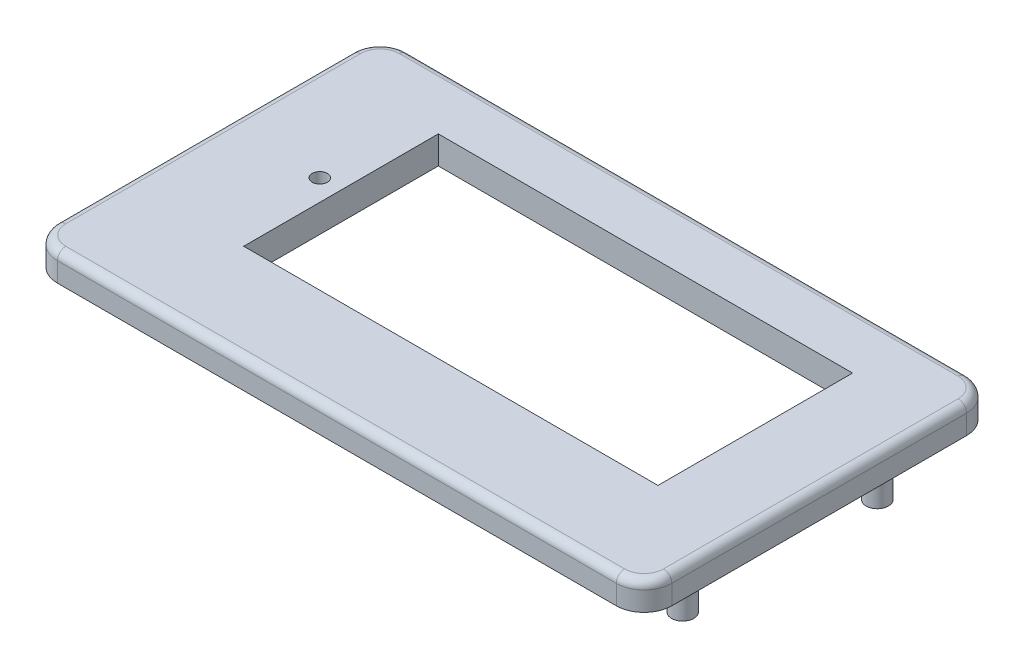
ISO-10303-21;
HEADER;
FILE_DESCRIPTION(('STEP AP214'),'2;1');
FILE_NAME('part.step','',(''),(''),'','','');
FILE_SCHEMA(('AUTOMOTIVE_DESIGN { 1 0 10303 214 1 1 1 1 }'));
ENDSEC;
DATA;
#1=APPLICATION_CONTEXT('core data for automotive mechanical design processes');
#2=APPLICATION_PROTOCOL_DEFINITION('international standard','automotive_design',2000,#1);
#3=PRODUCT_CONTEXT('',#1,'mechanical');
#4=PRODUCT('Part','Part','',(#3));
#5=PRODUCT_RELATED_PRODUCT_CATEGORY('part','',(#4));
#6=PRODUCT_DEFINITION_FORMATION('','',#4);
#7=PRODUCT_DEFINITION_CONTEXT('part definition',#1,'design');
#8=PRODUCT_DEFINITION('design','',#6,#7);
#9=PRODUCT_DEFINITION_SHAPE('','',#8);
#10=(LENGTH_UNIT() NAMED_UNIT(*) SI_UNIT(.MILLI.,.METRE.));
#11=(NAMED_UNIT(*) PLANE_ANGLE_UNIT() SI_UNIT($,.RADIAN.));
#12=(NAMED_UNIT(*) SI_UNIT($,.STERADIAN.) SOLID_ANGLE_UNIT());
#13=UNCERTAINTY_MEASURE_WITH_UNIT(LENGTH_MEASURE(1.E-05),#10,'distance_accuracy_value','');
#14=(GEOMETRIC_REPRESENTATION_CONTEXT(3) GLOBAL_UNCERTAINTY_ASSIGNED_CONTEXT((#13)) GLOBAL_UNIT_ASSIGNED_CONTEXT((#10,
#11,#12)) REPRESENTATION_CONTEXT('',''));
#15=CARTESIAN_POINT('',(0.,0.,0.));
#16=DIRECTION('',(0.,0.,1.));
#17=DIRECTION('',(1.,0.,0.));
#18=AXIS2_PLACEMENT_3D('',#15,#16,#17);
#19=CARTESIAN_POINT('',(28.067,2.54,16.002));
#20=DIRECTION('',(-1.,0.,0.));
#21=DIRECTION('',(0.,0.,1.));
#22=AXIS2_PLACEMENT_3D('',#19,#20,#21);
#23=PLANE('',#22);
#24=DIRECTION('',(0.,-1.,0.));
#25=VECTOR('',#24,1.);
#26=CARTESIAN_POINT('',(28.067,2.54,-13.462));
#27=LINE('',#26,#25);
#28=CARTESIAN_POINT('',(28.067,0.,-13.462));
#29=VERTEX_POINT('',#28);
#30=CARTESIAN_POINT('',(28.067,1.778,-13.462));
#31=VERTEX_POINT('',#30);
#32=EDGE_CURVE('E228',#29,#31,#27,.F.);
#33=ORIENTED_EDGE('',*,*,#32,.T.);
#34=DIRECTION('',(0.,0.,-1.));
#35=VECTOR('',#34,1.);
#36=CARTESIAN_POINT('',(28.067,1.778,16.002));
#37=LINE('',#36,#35);
#38=CARTESIAN_POINT('',(28.067,1.778,13.462));
#39=VERTEX_POINT('',#38);
#40=EDGE_CURVE('E65',#31,#39,#37,.F.);
#41=ORIENTED_EDGE('',*,*,#40,.T.);
#42=DIRECTION('',(0.,-1.,0.));
#43=VECTOR('',#42,1.);
#44=CARTESIAN_POINT('',(28.067,2.54,13.462));
#45=LINE('',#44,#43);
#46=CARTESIAN_POINT('',(28.067,0.,13.462));
#47=VERTEX_POINT('',#46);
#48=EDGE_CURVE('E226',#39,#47,#45,.T.);
#49=ORIENTED_EDGE('',*,*,#48,.T.);
#50=DIRECTION('',(0.,0.,-1.));
#51=VECTOR('',#50,1.);
#52=CARTESIAN_POINT('',(28.067,0.,16.002));
#53=LINE('',#52,#51);
#54=EDGE_CURVE('E196',#47,#29,#53,.T.);
#55=ORIENTED_EDGE('',*,*,#54,.T.);
#56=EDGE_LOOP('',(#33,#41,#49,#55));
#57=FACE_BOUND('',#56,.T.);
#58=ADVANCED_FACE('F41',(#57),#23,.F.);
#59=CARTESIAN_POINT('',(-28.067,2.54,-16.002));
#60=DIRECTION('',(0.,0.,1.));
#61=DIRECTION('',(1.,0.,0.));
#62=AXIS2_PLACEMENT_3D('',#59,#60,#61);
#63=PLANE('',#62);
#64=DIRECTION('',(0.,-1.,0.));
#65=VECTOR('',#64,1.);
#66=CARTESIAN_POINT('',(-25.527,2.54,-16.002));
#67=LINE('',#66,#65);
#68=CARTESIAN_POINT('',(-25.527,0.,-16.002));
#69=VERTEX_POINT('',#68);
#70=CARTESIAN_POINT('',(-25.527,1.778,-16.002));
#71=VERTEX_POINT('',#70);
#72=EDGE_CURVE('E223',#69,#71,#67,.F.);
#73=ORIENTED_EDGE('',*,*,#72,.T.);
#74=DIRECTION('',(-1.,0.,0.));
#75=VECTOR('',#74,1.);
#76=CARTESIAN_POINT('',(-28.067,1.778,-16.002));
#77=LINE('',#76,#75);
#78=CARTESIAN_POINT('',(25.527,1.778,-16.002));
#79=VERTEX_POINT('',#78);
#80=EDGE_CURVE('E258',#71,#79,#77,.F.);
#81=ORIENTED_EDGE('',*,*,#80,.T.);
#82=DIRECTION('',(0.,-1.,0.));
#83=VECTOR('',#82,1.);
#84=CARTESIAN_POINT('',(25.527,2.54,-16.002));
#85=LINE('',#84,#83);
#86=CARTESIAN_POINT('',(25.527,0.,-16.002));
#87=VERTEX_POINT('',#86);
#88=EDGE_CURVE('E221',#79,#87,#85,.T.);
#89=ORIENTED_EDGE('',*,*,#88,.T.);
#90=DIRECTION('',(-1.,0.,0.));
#91=VECTOR('',#90,1.);
#92=CARTESIAN_POINT('',(-28.067,0.,-16.002));
#93=LINE('',#92,#91);
#94=EDGE_CURVE('E199',#87,#69,#93,.T.);
#95=ORIENTED_EDGE('',*,*,#94,.T.);
#96=EDGE_LOOP('',(#73,#81,#89,#95));
#97=FACE_BOUND('',#96,.T.);
#98=ADVANCED_FACE('F326',(#97),#63,.F.);
#99=CARTESIAN_POINT('',(-28.067,2.54,16.002));
#100=DIRECTION('',(1.,0.,0.));
#101=DIRECTION('',(0.,0.,-1.));
#102=AXIS2_PLACEMENT_3D('',#99,#100,#101);
#103=PLANE('',#102);
#104=DIRECTION('',(0.,-1.,0.));
#105=VECTOR('',#104,1.);
#106=CARTESIAN_POINT('',(-28.067,2.54,13.462));
#107=LINE('',#106,#105);
#108=CARTESIAN_POINT('',(-28.067,0.,13.462));
#109=VERTEX_POINT('',#108);
#110=CARTESIAN_POINT('',(-28.067,1.778,13.462));
#111=VERTEX_POINT('',#110);
#112=EDGE_CURVE('E208',#109,#111,#107,.F.);
#113=ORIENTED_EDGE('',*,*,#112,.T.);
#114=DIRECTION('',(0.,0.,1.));
#115=VECTOR('',#114,1.);
#116=CARTESIAN_POINT('',(-28.067,1.778,16.002));
#117=LINE('',#116,#115);
#118=CARTESIAN_POINT('',(-28.067,1.778,-13.462));
#119=VERTEX_POINT('',#118);
#120=EDGE_CURVE('E254',#111,#119,#117,.F.);
#121=ORIENTED_EDGE('',*,*,#120,.T.);
#122=DIRECTION('',(0.,-1.,0.));
#123=VECTOR('',#122,1.);
#124=CARTESIAN_POINT('',(-28.067,2.54,-13.462));
#125=LINE('',#124,#123);
#126=CARTESIAN_POINT('',(-28.067,0.,-13.462));
#127=VERTEX_POINT('',#126);
#128=EDGE_CURVE('E211',#119,#127,#125,.T.);
#129=ORIENTED_EDGE('',*,*,#128,.T.);
#130=DIRECTION('',(0.,0.,1.));
#131=VECTOR('',#130,1.);
#132=CARTESIAN_POINT('',(-28.067,0.,16.002));
#133=LINE('',#132,#131);
#134=EDGE_CURVE('E202',#127,#109,#133,.T.);
#135=ORIENTED_EDGE('',*,*,#134,.T.);
#136=EDGE_LOOP('',(#113,#121,#129,#135));
#137=FACE_BOUND('',#136,.T.);
#138=ADVANCED_FACE('F331',(#137),#103,.F.);
#139=CARTESIAN_POINT('',(-28.067,2.54,16.002));
#140=DIRECTION('',(0.,0.,-1.));
#141=DIRECTION('',(-1.,0.,0.));
#142=AXIS2_PLACEMENT_3D('',#139,#140,#141);
#143=PLANE('',#142);
#144=DIRECTION('',(0.,-1.,0.));
#145=VECTOR('',#144,1.);
#146=CARTESIAN_POINT('',(25.527,2.54,16.002));
#147=LINE('',#146,#145);
#148=CARTESIAN_POINT('',(25.527,0.,16.002));
#149=VERTEX_POINT('',#148);
#150=CARTESIAN_POINT('',(25.527,1.778,16.002));
#151=VERTEX_POINT('',#150);
#152=EDGE_CURVE('E232',#149,#151,#147,.F.);
#153=ORIENTED_EDGE('',*,*,#152,.T.);
#154=DIRECTION('',(1.,0.,0.));
#155=VECTOR('',#154,1.);
#156=CARTESIAN_POINT('',(-28.067,1.778,16.002));
#157=LINE('',#156,#155);
#158=CARTESIAN_POINT('',(-25.527,1.778,16.002));
#159=VERTEX_POINT('',#158);
#160=EDGE_CURVE('E11',#151,#159,#157,.F.);
#161=ORIENTED_EDGE('',*,*,#160,.T.);
#162=DIRECTION('',(0.,-1.,0.));
#163=VECTOR('',#162,1.);
#164=CARTESIAN_POINT('',(-25.527,2.54,16.002));
#165=LINE('',#164,#163);
#166=CARTESIAN_POINT('',(-25.527,0.,16.002));
#167=VERTEX_POINT('',#166);
#168=EDGE_CURVE('E230',#159,#167,#165,.T.);
#169=ORIENTED_EDGE('',*,*,#168,.T.);
#170=DIRECTION('',(1.,0.,0.));
#171=VECTOR('',#170,1.);
#172=CARTESIAN_POINT('',(-28.067,0.,16.002));
#173=LINE('',#172,#171);
#174=EDGE_CURVE('E205',#167,#149,#173,.T.);
#175=ORIENTED_EDGE('',*,*,#174,.T.);
#176=EDGE_LOOP('',(#153,#161,#169,#175));
#177=FACE_BOUND('',#176,.T.);
#178=ADVANCED_FACE('F396',(#177),#143,.F.);
#179=CARTESIAN_POINT('',(0.,2.54,0.));
#180=DIRECTION('',(0.,-1.,0.));
#181=DIRECTION('',(0.,0.,-1.));
#182=AXIS2_PLACEMENT_3D('',#179,#180,#181);
#183=PLANE('',#182);
#184=CARTESIAN_POINT('',(-19.3379315125295,2.54,-1.778));
#185=DIRECTION('',(0.,1.,0.));
#186=DIRECTION('',(0.,0.,1.));
#187=AXIS2_PLACEMENT_3D('',#184,#185,#186);
#188=CIRCLE('',#187,0.698500000000003);
#189=CARTESIAN_POINT('',(-19.3379315125295,2.54,-1.0795));
#190=VERTEX_POINT('',#189);
#191=EDGE_CURVE('E671',#190,#190,#188,.T.);
#192=ORIENTED_EDGE('',*,*,#191,.F.);
#193=EDGE_LOOP('',(#192));
#194=FACE_BOUND('',#193,.T.);
#195=DIRECTION('',(0.,0.,1.));
#196=VECTOR('',#195,1.);
#197=CARTESIAN_POINT('',(-27.305,2.54,0.));
#198=LINE('',#197,#196);
#199=CARTESIAN_POINT('',(-27.305,2.54,-13.462));
#200=VERTEX_POINT('',#199);
#201=CARTESIAN_POINT('',(-27.305,2.54,13.462));
#202=VERTEX_POINT('',#201);
#203=EDGE_CURVE('E246',#200,#202,#198,.T.);
#204=ORIENTED_EDGE('',*,*,#203,.T.);
#205=CARTESIAN_POINT('',(-25.527,2.54,13.462));
#206=DIRECTION('',(0.,-1.,0.));
#207=DIRECTION('',(0.,0.,-1.));
#208=AXIS2_PLACEMENT_3D('',#205,#206,#207);
#209=CIRCLE('',#208,1.778);
#210=CARTESIAN_POINT('',(-25.527,2.54,15.24));
#211=VERTEX_POINT('',#210);
#212=EDGE_CURVE('E248',#202,#211,#209,.F.);
#213=ORIENTED_EDGE('',*,*,#212,.T.);
#214=DIRECTION('',(1.,0.,0.));
#215=VECTOR('',#214,1.);
#216=CARTESIAN_POINT('',(0.,2.54,15.24));
#217=LINE('',#216,#215);
#218=CARTESIAN_POINT('',(25.527,2.54,15.24));
#219=VERTEX_POINT('',#218);
#220=EDGE_CURVE('E234',#211,#219,#217,.T.);
#221=ORIENTED_EDGE('',*,*,#220,.T.);
#222=CARTESIAN_POINT('',(25.527,2.54,13.462));
#223=DIRECTION('',(0.,-1.,0.));
#224=DIRECTION('',(0.,0.,-1.));
#225=AXIS2_PLACEMENT_3D('',#222,#223,#224);
#226=CIRCLE('',#225,1.778);
#227=CARTESIAN_POINT('',(27.305,2.54,13.462));
#228=VERTEX_POINT('',#227);
#229=EDGE_CURVE('E236',#219,#228,#226,.F.);
#230=ORIENTED_EDGE('',*,*,#229,.T.);
#231=DIRECTION('',(0.,0.,-1.));
#232=VECTOR('',#231,1.);
#233=CARTESIAN_POINT('',(27.305,2.54,0.));
#234=LINE('',#233,#232);
#235=CARTESIAN_POINT('',(27.305,2.54,-13.462));
#236=VERTEX_POINT('',#235);
#237=EDGE_CURVE('E238',#228,#236,#234,.T.);
#238=ORIENTED_EDGE('',*,*,#237,.T.);
#239=CARTESIAN_POINT('',(25.527,2.54,-13.462));
#240=DIRECTION('',(0.,-1.,0.));
#241=DIRECTION('',(0.,0.,-1.));
#242=AXIS2_PLACEMENT_3D('',#239,#240,#241);
#243=CIRCLE('',#242,1.778);
#244=CARTESIAN_POINT('',(25.527,2.54,-15.24));
#245=VERTEX_POINT('',#244);
#246=EDGE_CURVE('E240',#236,#245,#243,.F.);
#247=ORIENTED_EDGE('',*,*,#246,.T.);
#248=DIRECTION('',(-1.,0.,0.));
#249=VECTOR('',#248,1.);
#250=CARTESIAN_POINT('',(0.,2.54,-15.24));
#251=LINE('',#250,#249);
#252=CARTESIAN_POINT('',(-25.527,2.54,-15.24));
#253=VERTEX_POINT('',#252);
#254=EDGE_CURVE('E242',#245,#253,#251,.T.);
#255=ORIENTED_EDGE('',*,*,#254,.T.);
#256=CARTESIAN_POINT('',(-25.527,2.54,-13.462));
#257=DIRECTION('',(0.,-1.,0.));
#258=DIRECTION('',(0.,0.,-1.));
#259=AXIS2_PLACEMENT_3D('',#256,#257,#258);
#260=CIRCLE('',#259,1.778);
#261=EDGE_CURVE('E244',#253,#200,#260,.F.);
#262=ORIENTED_EDGE('',*,*,#261,.T.);
#263=EDGE_LOOP('',(#204,#213,#221,#230,#238,#247,#255,#262));
#264=FACE_BOUND('',#263,.T.);
#265=DIRECTION('',(0.,0.,-1.));
#266=VECTOR('',#265,1.);
#267=CARTESIAN_POINT('',(20.447,2.54,7.112));
#268=LINE('',#267,#266);
#269=CARTESIAN_POINT('',(20.447,2.54,7.112));
#270=VERTEX_POINT('',#269);
#271=CARTESIAN_POINT('',(20.447,2.54,-10.668));
#272=VERTEX_POINT('',#271);
#273=EDGE_CURVE('E181',#270,#272,#268,.T.);
#274=ORIENTED_EDGE('',*,*,#273,.F.);
#275=DIRECTION('',(1.,0.,0.));
#276=VECTOR('',#275,1.);
#277=CARTESIAN_POINT('',(20.447,2.54,7.112));
#278=LINE('',#277,#276);
#279=CARTESIAN_POINT('',(-17.399,2.54,7.112));
#280=VERTEX_POINT('',#279);
#281=EDGE_CURVE('E173',#280,#270,#278,.T.);
#282=ORIENTED_EDGE('',*,*,#281,.F.);
#283=DIRECTION('',(0.,0.,1.));
#284=VECTOR('',#283,1.);
#285=CARTESIAN_POINT('',(-17.399,2.54,7.112));
#286=LINE('',#285,#284);
#287=CARTESIAN_POINT('',(-17.399,2.54,-10.668));
#288=VERTEX_POINT('',#287);
#289=EDGE_CURVE('E185',#288,#280,#286,.T.);
#290=ORIENTED_EDGE('',*,*,#289,.F.);
#291=DIRECTION('',(-1.,0.,0.));
#292=VECTOR('',#291,1.);
#293=CARTESIAN_POINT('',(20.447,2.54,-10.668));
#294=LINE('',#293,#292);
#295=EDGE_CURVE('E179',#272,#288,#294,.T.);
#296=ORIENTED_EDGE('',*,*,#295,.F.);
#297=EDGE_LOOP('',(#274,#282,#290,#296));
#298=FACE_BOUND('',#297,.T.);
#299=ADVANCED_FACE('F313',(#194,#264,#298),#183,.F.);
#300=CARTESIAN_POINT('',(0.,0.,0.));
#301=DIRECTION('',(0.,-1.,0.));
#302=DIRECTION('',(0.,0.,-1.));
#303=AXIS2_PLACEMENT_3D('',#300,#301,#302);
#304=PLANE('',#303);
#305=CARTESIAN_POINT('',(-19.3379315125295,0.,-1.778));
#306=DIRECTION('',(0.,-1.,0.));
#307=DIRECTION('',(0.,0.,-1.));
#308=AXIS2_PLACEMENT_3D('',#305,#306,#307);
#309=CIRCLE('',#308,0.698500000000003);
#310=CARTESIAN_POINT('',(-19.3379315125295,0.,-2.4765));
#311=VERTEX_POINT('',#310);
#312=EDGE_CURVE('E267',#311,#311,#309,.F.);
#313=ORIENTED_EDGE('',*,*,#312,.T.);
#314=EDGE_LOOP('',(#313));
#315=FACE_BOUND('',#314,.T.);
#316=CARTESIAN_POINT('',(22.7076,0.,-10.668));
#317=DIRECTION('',(0.,-1.,0.));
#318=DIRECTION('',(0.,0.,-1.));
#319=AXIS2_PLACEMENT_3D('',#316,#317,#318);
#320=CIRCLE('',#319,1.016);
#321=CARTESIAN_POINT('',(22.7076,0.,-11.684));
#322=VERTEX_POINT('',#321);
#323=EDGE_CURVE('E292',#322,#322,#320,.T.);
#324=ORIENTED_EDGE('',*,*,#323,.F.);
#325=EDGE_LOOP('',(#324));
#326=FACE_BOUND('',#325,.T.);
#327=CARTESIAN_POINT('',(22.7076,0.,7.112));
#328=DIRECTION('',(0.,-1.,0.));
#329=DIRECTION('',(0.,0.,-1.));
#330=AXIS2_PLACEMENT_3D('',#327,#328,#329);
#331=CIRCLE('',#330,1.016);
#332=CARTESIAN_POINT('',(22.7076,0.,6.096));
#333=VERTEX_POINT('',#332);
#334=EDGE_CURVE('E297',#333,#333,#331,.T.);
#335=ORIENTED_EDGE('',*,*,#334,.F.);
#336=EDGE_LOOP('',(#335));
#337=FACE_BOUND('',#336,.T.);
#338=DIRECTION('',(1.,0.,0.));
#339=VECTOR('',#338,1.);
#340=CARTESIAN_POINT('',(20.447,0.,7.112));
#341=LINE('',#340,#339);
#342=CARTESIAN_POINT('',(-17.399,0.,7.112));
#343=VERTEX_POINT('',#342);
#344=CARTESIAN_POINT('',(20.447,0.,7.112));
#345=VERTEX_POINT('',#344);
#346=EDGE_CURVE('E170',#343,#345,#341,.T.);
#347=ORIENTED_EDGE('',*,*,#346,.T.);
#348=DIRECTION('',(0.,0.,-1.));
#349=VECTOR('',#348,1.);
#350=CARTESIAN_POINT('',(20.447,0.,7.112));
#351=LINE('',#350,#349);
#352=CARTESIAN_POINT('',(20.447,0.,-10.668));
#353=VERTEX_POINT('',#352);
#354=EDGE_CURVE('E156',#345,#353,#351,.T.);
#355=ORIENTED_EDGE('',*,*,#354,.T.);
#356=DIRECTION('',(-1.,0.,0.));
#357=VECTOR('',#356,1.);
#358=CARTESIAN_POINT('',(20.447,0.,-10.668));
#359=LINE('',#358,#357);
#360=CARTESIAN_POINT('',(-17.399,0.,-10.668));
#361=VERTEX_POINT('',#360);
#362=EDGE_CURVE('E190',#353,#361,#359,.T.);
#363=ORIENTED_EDGE('',*,*,#362,.T.);
#364=DIRECTION('',(0.,0.,1.));
#365=VECTOR('',#364,1.);
#366=CARTESIAN_POINT('',(-17.399,0.,7.112));
#367=LINE('',#366,#365);
#368=EDGE_CURVE('E178',#361,#343,#367,.T.);
#369=ORIENTED_EDGE('',*,*,#368,.T.);
#370=EDGE_LOOP('',(#347,#355,#363,#369));
#371=FACE_BOUND('',#370,.T.);
#372=ORIENTED_EDGE('',*,*,#134,.F.);
#373=CARTESIAN_POINT('',(-25.527,0.,-13.462));
#374=DIRECTION('',(0.,-1.,0.));
#375=DIRECTION('',(0.,0.,-1.));
#376=AXIS2_PLACEMENT_3D('',#373,#374,#375);
#377=CIRCLE('',#376,2.54);
#378=EDGE_CURVE('E219',#127,#69,#377,.T.);
#379=ORIENTED_EDGE('',*,*,#378,.T.);
#380=ORIENTED_EDGE('',*,*,#94,.F.);
#381=CARTESIAN_POINT('',(25.527,0.,-13.462));
#382=DIRECTION('',(0.,-1.,0.));
#383=DIRECTION('',(0.,0.,-1.));
#384=AXIS2_PLACEMENT_3D('',#381,#382,#383);
#385=CIRCLE('',#384,2.54);
#386=EDGE_CURVE('E217',#87,#29,#385,.T.);
#387=ORIENTED_EDGE('',*,*,#386,.T.);
#388=ORIENTED_EDGE('',*,*,#54,.F.);
#389=CARTESIAN_POINT('',(25.527,0.,13.462));
#390=DIRECTION('',(0.,-1.,0.));
#391=DIRECTION('',(0.,0.,-1.));
#392=AXIS2_PLACEMENT_3D('',#389,#390,#391);
#393=CIRCLE('',#392,2.54);
#394=EDGE_CURVE('E215',#47,#149,#393,.T.);
#395=ORIENTED_EDGE('',*,*,#394,.T.);
#396=ORIENTED_EDGE('',*,*,#174,.F.);
#397=CARTESIAN_POINT('',(-25.527,0.,13.462));
#398=DIRECTION('',(0.,-1.,0.));
#399=DIRECTION('',(0.,0.,-1.));
#400=AXIS2_PLACEMENT_3D('',#397,#398,#399);
#401=CIRCLE('',#400,2.54);
#402=EDGE_CURVE('E213',#167,#109,#401,.T.);
#403=ORIENTED_EDGE('',*,*,#402,.T.);
#404=EDGE_LOOP('',(#372,#379,#380,#387,#388,#395,#396,#403));
#405=FACE_BOUND('',#404,.T.);
#406=ADVANCED_FACE('F176',(#315,#326,#337,#371,#405),#304,.T.);
#407=CARTESIAN_POINT('',(20.447,-41.8144486511541,7.112));
#408=DIRECTION('',(0.,0.,1.));
#409=DIRECTION('',(1.,0.,0.));
#410=AXIS2_PLACEMENT_3D('',#407,#408,#409);
#411=PLANE('',#410);
#412=DIRECTION('',(0.,1.,0.));
#413=VECTOR('',#412,1.);
#414=CARTESIAN_POINT('',(-17.399,-41.8144486511541,7.112));
#415=LINE('',#414,#413);
#416=EDGE_CURVE('E188',#343,#280,#415,.T.);
#417=ORIENTED_EDGE('',*,*,#416,.T.);
#418=ORIENTED_EDGE('',*,*,#281,.T.);
#419=DIRECTION('',(0.,1.,0.));
#420=VECTOR('',#419,1.);
#421=CARTESIAN_POINT('',(20.447,-41.8144486511541,7.112));
#422=LINE('',#421,#420);
#423=EDGE_CURVE('E160',#345,#270,#422,.T.);
#424=ORIENTED_EDGE('',*,*,#423,.F.);
#425=ORIENTED_EDGE('',*,*,#346,.F.);
#426=EDGE_LOOP('',(#417,#418,#424,#425));
#427=FACE_BOUND('',#426,.T.);
#428=ADVANCED_FACE('F169',(#427),#411,.F.);
#429=CARTESIAN_POINT('',(20.447,-41.8144486511541,7.112));
#430=DIRECTION('',(1.,0.,0.));
#431=DIRECTION('',(0.,0.,-1.));
#432=AXIS2_PLACEMENT_3D('',#429,#430,#431);
#433=PLANE('',#432);
#434=ORIENTED_EDGE('',*,*,#423,.T.);
#435=ORIENTED_EDGE('',*,*,#273,.T.);
#436=DIRECTION('',(0.,1.,0.));
#437=VECTOR('',#436,1.);
#438=CARTESIAN_POINT('',(20.447,-41.8144486511541,-10.668));
#439=LINE('',#438,#437);
#440=EDGE_CURVE('E162',#353,#272,#439,.T.);
#441=ORIENTED_EDGE('',*,*,#440,.F.);
#442=ORIENTED_EDGE('',*,*,#354,.F.);
#443=EDGE_LOOP('',(#434,#435,#441,#442));
#444=FACE_BOUND('',#443,.T.);
#445=ADVANCED_FACE('F158',(#444),#433,.F.);
#446=CARTESIAN_POINT('',(20.447,-41.8144486511541,-10.668));
#447=DIRECTION('',(0.,0.,-1.));
#448=DIRECTION('',(-1.,0.,0.));
#449=AXIS2_PLACEMENT_3D('',#446,#447,#448);
#450=PLANE('',#449);
#451=ORIENTED_EDGE('',*,*,#440,.T.);
#452=ORIENTED_EDGE('',*,*,#295,.T.);
#453=DIRECTION('',(0.,1.,0.));
#454=VECTOR('',#453,1.);
#455=CARTESIAN_POINT('',(-17.399,-41.8144486511541,-10.668));
#456=LINE('',#455,#454);
#457=EDGE_CURVE('E189',#361,#288,#456,.T.);
#458=ORIENTED_EDGE('',*,*,#457,.F.);
#459=ORIENTED_EDGE('',*,*,#362,.F.);
#460=EDGE_LOOP('',(#451,#452,#458,#459));
#461=FACE_BOUND('',#460,.T.);
#462=ADVANCED_FACE('F315',(#461),#450,.F.);
#463=CARTESIAN_POINT('',(-17.399,-41.8144486511541,7.112));
#464=DIRECTION('',(-1.,0.,0.));
#465=DIRECTION('',(0.,0.,1.));
#466=AXIS2_PLACEMENT_3D('',#463,#464,#465);
#467=PLANE('',#466);
#468=ORIENTED_EDGE('',*,*,#457,.T.);
#469=ORIENTED_EDGE('',*,*,#289,.T.);
#470=ORIENTED_EDGE('',*,*,#416,.F.);
#471=ORIENTED_EDGE('',*,*,#368,.F.);
#472=EDGE_LOOP('',(#468,#469,#470,#471));
#473=FACE_BOUND('',#472,.T.);
#474=ADVANCED_FACE('F309',(#473),#467,.F.);
#475=CARTESIAN_POINT('',(-25.527,2.54,-13.462));
#476=DIRECTION('',(0.,-1.,0.));
#477=DIRECTION('',(0.,0.,-1.));
#478=AXIS2_PLACEMENT_3D('',#475,#476,#477);
#479=CYLINDRICAL_SURFACE('',#478,2.54);
#480=ORIENTED_EDGE('',*,*,#128,.F.);
#481=CARTESIAN_POINT('',(-25.527,1.778,-13.462));
#482=DIRECTION('',(0.,-1.,0.));
#483=DIRECTION('',(0.,0.,-1.));
#484=AXIS2_PLACEMENT_3D('',#481,#482,#483);
#485=CIRCLE('',#484,2.54);
#486=EDGE_CURVE('E256',#119,#71,#485,.T.);
#487=ORIENTED_EDGE('',*,*,#486,.T.);
#488=ORIENTED_EDGE('',*,*,#72,.F.);
#489=ORIENTED_EDGE('',*,*,#378,.F.);
#490=EDGE_LOOP('',(#480,#487,#488,#489));
#491=FACE_BOUND('',#490,.T.);
#492=ADVANCED_FACE('F322',(#491),#479,.T.);
#493=CARTESIAN_POINT('',(25.527,2.54,-13.462));
#494=DIRECTION('',(0.,-1.,0.));
#495=DIRECTION('',(0.,0.,-1.));
#496=AXIS2_PLACEMENT_3D('',#493,#494,#495);
#497=CYLINDRICAL_SURFACE('',#496,2.54);
#498=ORIENTED_EDGE('',*,*,#88,.F.);
#499=CARTESIAN_POINT('',(25.527,1.778,-13.462));
#500=DIRECTION('',(0.,-1.,0.));
#501=DIRECTION('',(0.,0.,-1.));
#502=AXIS2_PLACEMENT_3D('',#499,#500,#501);
#503=CIRCLE('',#502,2.54);
#504=EDGE_CURVE('E260',#79,#31,#503,.T.);
#505=ORIENTED_EDGE('',*,*,#504,.T.);
#506=ORIENTED_EDGE('',*,*,#32,.F.);
#507=ORIENTED_EDGE('',*,*,#386,.F.);
#508=EDGE_LOOP('',(#498,#505,#506,#507));
#509=FACE_BOUND('',#508,.T.);
#510=ADVANCED_FACE('F338',(#509),#497,.T.);
#511=CARTESIAN_POINT('',(25.527,2.54,13.462));
#512=DIRECTION('',(0.,-1.,0.));
#513=DIRECTION('',(0.,0.,-1.));
#514=AXIS2_PLACEMENT_3D('',#511,#512,#513);
#515=CYLINDRICAL_SURFACE('',#514,2.54);
#516=ORIENTED_EDGE('',*,*,#48,.F.);
#517=CARTESIAN_POINT('',(25.527,1.778,13.462));
#518=DIRECTION('',(0.,-1.,0.));
#519=DIRECTION('',(0.,0.,-1.));
#520=AXIS2_PLACEMENT_3D('',#517,#518,#519);
#521=CIRCLE('',#520,2.54);
#522=EDGE_CURVE('E50',#39,#151,#521,.T.);
#523=ORIENTED_EDGE('',*,*,#522,.T.);
#524=ORIENTED_EDGE('',*,*,#152,.F.);
#525=ORIENTED_EDGE('',*,*,#394,.F.);
#526=EDGE_LOOP('',(#516,#523,#524,#525));
#527=FACE_BOUND('',#526,.T.);
#528=ADVANCED_FACE('F342',(#527),#515,.T.);
#529=CARTESIAN_POINT('',(-25.527,2.54,13.462));
#530=DIRECTION('',(0.,-1.,0.));
#531=DIRECTION('',(0.,0.,-1.));
#532=AXIS2_PLACEMENT_3D('',#529,#530,#531);
#533=CYLINDRICAL_SURFACE('',#532,2.54);
#534=ORIENTED_EDGE('',*,*,#168,.F.);
#535=CARTESIAN_POINT('',(-25.527,1.778,13.462));
#536=DIRECTION('',(0.,-1.,0.));
#537=DIRECTION('',(0.,0.,-1.));
#538=AXIS2_PLACEMENT_3D('',#535,#536,#537);
#539=CIRCLE('',#538,2.54);
#540=EDGE_CURVE('E251',#159,#111,#539,.T.);
#541=ORIENTED_EDGE('',*,*,#540,.T.);
#542=ORIENTED_EDGE('',*,*,#112,.F.);
#543=ORIENTED_EDGE('',*,*,#402,.F.);
#544=EDGE_LOOP('',(#534,#541,#542,#543));
#545=FACE_BOUND('',#544,.T.);
#546=ADVANCED_FACE('F346',(#545),#533,.T.);
#547=CARTESIAN_POINT('',(22.7076,-6.35,7.112));
#548=DIRECTION('',(0.,1.,0.));
#549=DIRECTION('',(0.,0.,1.));
#550=AXIS2_PLACEMENT_3D('',#547,#548,#549);
#551=CYLINDRICAL_SURFACE('',#550,1.016);
#552=CARTESIAN_POINT('',(22.7076,-6.35,7.112));
#553=DIRECTION('',(0.,-1.,0.));
#554=DIRECTION('',(0.,0.,-1.));
#555=AXIS2_PLACEMENT_3D('',#552,#553,#554);
#556=CIRCLE('',#555,1.016);
#557=CARTESIAN_POINT('',(22.7076,-6.35,6.096));
#558=VERTEX_POINT('',#557);
#559=EDGE_CURVE('E301',#558,#558,#556,.T.);
#560=ORIENTED_EDGE('',*,*,#559,.F.);
#561=EDGE_LOOP('',(#560));
#562=FACE_BOUND('',#561,.T.);
#563=ORIENTED_EDGE('',*,*,#334,.T.);
#564=EDGE_LOOP('',(#563));
#565=FACE_BOUND('',#564,.T.);
#566=ADVANCED_FACE('F349',(#562,#565),#551,.T.);
#567=CARTESIAN_POINT('',(22.7076,-6.35,7.112));
#568=DIRECTION('',(0.,-1.,0.));
#569=DIRECTION('',(0.,0.,-1.));
#570=AXIS2_PLACEMENT_3D('',#567,#568,#569);
#571=PLANE('',#570);
#572=ORIENTED_EDGE('',*,*,#559,.T.);
#573=EDGE_LOOP('',(#572));
#574=FACE_BOUND('',#573,.T.);
#575=ADVANCED_FACE('F549',(#574),#571,.T.);
#576=CARTESIAN_POINT('',(22.7076,-6.35,-10.668));
#577=DIRECTION('',(0.,1.,0.));
#578=DIRECTION('',(0.,0.,1.));
#579=AXIS2_PLACEMENT_3D('',#576,#577,#578);
#580=CYLINDRICAL_SURFACE('',#579,1.016);
#581=CARTESIAN_POINT('',(22.7076,-6.35,-10.668));
#582=DIRECTION('',(0.,-1.,0.));
#583=DIRECTION('',(0.,0.,-1.));
#584=AXIS2_PLACEMENT_3D('',#581,#582,#583);
#585=CIRCLE('',#584,1.016);
#586=CARTESIAN_POINT('',(22.7076,-6.35,-11.684));
#587=VERTEX_POINT('',#586);
#588=EDGE_CURVE('E286',#587,#587,#585,.T.);
#589=ORIENTED_EDGE('',*,*,#588,.F.);
#590=EDGE_LOOP('',(#589));
#591=FACE_BOUND('',#590,.T.);
#592=ORIENTED_EDGE('',*,*,#323,.T.);
#593=EDGE_LOOP('',(#592));
#594=FACE_BOUND('',#593,.T.);
#595=ADVANCED_FACE('F384',(#591,#594),#580,.T.);
#596=CARTESIAN_POINT('',(22.7076,-6.35,-10.668));
#597=DIRECTION('',(0.,-1.,0.));
#598=DIRECTION('',(0.,0.,-1.));
#599=AXIS2_PLACEMENT_3D('',#596,#597,#598);
#600=PLANE('',#599);
#601=ORIENTED_EDGE('',*,*,#588,.T.);
#602=EDGE_LOOP('',(#601));
#603=FACE_BOUND('',#602,.T.);
#604=ADVANCED_FACE('F379',(#603),#600,.T.);
#605=CARTESIAN_POINT('',(25.527,1.778,-13.462));
#606=DIRECTION('',(0.,-1.,0.));
#607=DIRECTION('',(0.,0.,-1.));
#608=AXIS2_PLACEMENT_3D('',#605,#606,#607);
#609=TOROIDAL_SURFACE('',#608,1.778,0.762);
#610=CARTESIAN_POINT('',(27.305,1.778,-13.462));
#611=DIRECTION('',(0.,0.,1.));
#612=DIRECTION('',(1.,0.,0.));
#613=AXIS2_PLACEMENT_3D('',#610,#611,#612);
#614=CIRCLE('',#613,0.762);
#615=EDGE_CURVE('E280',#31,#236,#614,.T.);
#616=ORIENTED_EDGE('',*,*,#615,.F.);
#617=ORIENTED_EDGE('',*,*,#504,.F.);
#618=CARTESIAN_POINT('',(25.527,1.778,-15.24));
#619=DIRECTION('',(-1.,0.,0.));
#620=DIRECTION('',(0.,0.,1.));
#621=AXIS2_PLACEMENT_3D('',#618,#619,#620);
#622=CIRCLE('',#621,0.762);
#623=EDGE_CURVE('E45',#245,#79,#622,.T.);
#624=ORIENTED_EDGE('',*,*,#623,.F.);
#625=ORIENTED_EDGE('',*,*,#246,.F.);
#626=EDGE_LOOP('',(#616,#617,#624,#625));
#627=FACE_BOUND('',#626,.T.);
#628=ADVANCED_FACE('F43',(#627),#609,.T.);
#629=CARTESIAN_POINT('',(0.,1.778,-15.24));
#630=DIRECTION('',(-1.,0.,0.));
#631=DIRECTION('',(0.,0.,1.));
#632=AXIS2_PLACEMENT_3D('',#629,#630,#631);
#633=CYLINDRICAL_SURFACE('',#632,0.762);
#634=ORIENTED_EDGE('',*,*,#623,.T.);
#635=ORIENTED_EDGE('',*,*,#80,.F.);
#636=CARTESIAN_POINT('',(-25.527,1.778,-15.24));
#637=DIRECTION('',(-1.,0.,0.));
#638=DIRECTION('',(0.,0.,1.));
#639=AXIS2_PLACEMENT_3D('',#636,#637,#638);
#640=CIRCLE('',#639,0.762);
#641=EDGE_CURVE('E278',#253,#71,#640,.T.);
#642=ORIENTED_EDGE('',*,*,#641,.F.);
#643=ORIENTED_EDGE('',*,*,#254,.F.);
#644=EDGE_LOOP('',(#634,#635,#642,#643));
#645=FACE_BOUND('',#644,.T.);
#646=ADVANCED_FACE('F374',(#645),#633,.T.);
#647=CARTESIAN_POINT('',(27.305,1.778,0.));
#648=DIRECTION('',(0.,0.,-1.));
#649=DIRECTION('',(-1.,0.,0.));
#650=AXIS2_PLACEMENT_3D('',#647,#648,#649);
#651=CYLINDRICAL_SURFACE('',#650,0.762);
#652=ORIENTED_EDGE('',*,*,#615,.T.);
#653=ORIENTED_EDGE('',*,*,#237,.F.);
#654=CARTESIAN_POINT('',(27.305,1.778,13.462));
#655=DIRECTION('',(0.,0.,1.));
#656=DIRECTION('',(1.,0.,0.));
#657=AXIS2_PLACEMENT_3D('',#654,#655,#656);
#658=CIRCLE('',#657,0.762);
#659=EDGE_CURVE('E275',#39,#228,#658,.T.);
#660=ORIENTED_EDGE('',*,*,#659,.F.);
#661=ORIENTED_EDGE('',*,*,#40,.F.);
#662=EDGE_LOOP('',(#652,#653,#660,#661));
#663=FACE_BOUND('',#662,.T.);
#664=ADVANCED_FACE('F371',(#663),#651,.T.);
#665=CARTESIAN_POINT('',(-25.527,1.778,-13.462));
#666=DIRECTION('',(0.,-1.,0.));
#667=DIRECTION('',(0.,0.,-1.));
#668=AXIS2_PLACEMENT_3D('',#665,#666,#667);
#669=TOROIDAL_SURFACE('',#668,1.778,0.762);
#670=ORIENTED_EDGE('',*,*,#641,.T.);
#671=ORIENTED_EDGE('',*,*,#486,.F.);
#672=CARTESIAN_POINT('',(-27.305,1.778,-13.462));
#673=DIRECTION('',(0.,0.,1.));
#674=DIRECTION('',(1.,0.,0.));
#675=AXIS2_PLACEMENT_3D('',#672,#673,#674);
#676=CIRCLE('',#675,0.762);
#677=EDGE_CURVE('E272',#200,#119,#676,.T.);
#678=ORIENTED_EDGE('',*,*,#677,.F.);
#679=ORIENTED_EDGE('',*,*,#261,.F.);
#680=EDGE_LOOP('',(#670,#671,#678,#679));
#681=FACE_BOUND('',#680,.T.);
#682=ADVANCED_FACE('F367',(#681),#669,.T.);
#683=CARTESIAN_POINT('',(25.527,1.778,13.462));
#684=DIRECTION('',(0.,-1.,0.));
#685=DIRECTION('',(0.,0.,-1.));
#686=AXIS2_PLACEMENT_3D('',#683,#684,#685);
#687=TOROIDAL_SURFACE('',#686,1.778,0.762);
#688=ORIENTED_EDGE('',*,*,#659,.T.);
#689=ORIENTED_EDGE('',*,*,#229,.F.);
#690=CARTESIAN_POINT('',(25.527,1.778,15.24));
#691=DIRECTION('',(-1.,0.,0.));
#692=DIRECTION('',(0.,0.,1.));
#693=AXIS2_PLACEMENT_3D('',#690,#691,#692);
#694=CIRCLE('',#693,0.762);
#695=EDGE_CURVE('E269',#151,#219,#694,.T.);
#696=ORIENTED_EDGE('',*,*,#695,.F.);
#697=ORIENTED_EDGE('',*,*,#522,.F.);
#698=EDGE_LOOP('',(#688,#689,#696,#697));
#699=FACE_BOUND('',#698,.T.);
#700=ADVANCED_FACE('F363',(#699),#687,.T.);
#701=CARTESIAN_POINT('',(-27.305,1.778,0.));
#702=DIRECTION('',(0.,0.,1.));
#703=DIRECTION('',(1.,0.,0.));
#704=AXIS2_PLACEMENT_3D('',#701,#702,#703);
#705=CYLINDRICAL_SURFACE('',#704,0.762);
#706=ORIENTED_EDGE('',*,*,#677,.T.);
#707=ORIENTED_EDGE('',*,*,#120,.F.);
#708=CARTESIAN_POINT('',(-27.305,1.778,13.462));
#709=DIRECTION('',(0.,0.,1.));
#710=DIRECTION('',(1.,0.,0.));
#711=AXIS2_PLACEMENT_3D('',#708,#709,#710);
#712=CIRCLE('',#711,0.762);
#713=EDGE_CURVE('E266',#202,#111,#712,.T.);
#714=ORIENTED_EDGE('',*,*,#713,.F.);
#715=ORIENTED_EDGE('',*,*,#203,.F.);
#716=EDGE_LOOP('',(#706,#707,#714,#715));
#717=FACE_BOUND('',#716,.T.);
#718=ADVANCED_FACE('F359',(#717),#705,.T.);
#719=CARTESIAN_POINT('',(0.,1.778,15.24));
#720=DIRECTION('',(1.,0.,0.));
#721=DIRECTION('',(0.,0.,-1.));
#722=AXIS2_PLACEMENT_3D('',#719,#720,#721);
#723=CYLINDRICAL_SURFACE('',#722,0.762);
#724=ORIENTED_EDGE('',*,*,#695,.T.);
#725=ORIENTED_EDGE('',*,*,#220,.F.);
#726=CARTESIAN_POINT('',(-25.527,1.778,15.24));
#727=DIRECTION('',(-1.,0.,0.));
#728=DIRECTION('',(0.,0.,1.));
#729=AXIS2_PLACEMENT_3D('',#726,#727,#728);
#730=CIRCLE('',#729,0.762);
#731=EDGE_CURVE('E264',#159,#211,#730,.T.);
#732=ORIENTED_EDGE('',*,*,#731,.F.);
#733=ORIENTED_EDGE('',*,*,#160,.F.);
#734=EDGE_LOOP('',(#724,#725,#732,#733));
#735=FACE_BOUND('',#734,.T.);
#736=ADVANCED_FACE('F355',(#735),#723,.T.);
#737=CARTESIAN_POINT('',(-25.527,1.778,13.462));
#738=DIRECTION('',(0.,-1.,0.));
#739=DIRECTION('',(0.,0.,-1.));
#740=AXIS2_PLACEMENT_3D('',#737,#738,#739);
#741=TOROIDAL_SURFACE('',#740,1.778,0.762);
#742=ORIENTED_EDGE('',*,*,#713,.T.);
#743=ORIENTED_EDGE('',*,*,#540,.F.);
#744=ORIENTED_EDGE('',*,*,#731,.T.);
#745=ORIENTED_EDGE('',*,*,#212,.F.);
#746=EDGE_LOOP('',(#742,#743,#744,#745));
#747=FACE_BOUND('',#746,.T.);
#748=ADVANCED_FACE('F351',(#747),#741,.T.);
#749=CARTESIAN_POINT('',(-19.3379315125295,-1.97565634663522,-1.778));
#750=DIRECTION('',(0.,1.,0.));
#751=DIRECTION('',(0.,0.,1.));
#752=AXIS2_PLACEMENT_3D('',#749,#750,#751);
#753=CYLINDRICAL_SURFACE('',#752,0.698500000000003);
#754=ORIENTED_EDGE('',*,*,#191,.T.);
#755=EDGE_LOOP('',(#754));
#756=FACE_BOUND('',#755,.T.);
#757=ORIENTED_EDGE('',*,*,#312,.F.);
#758=EDGE_LOOP('',(#757));
#759=FACE_BOUND('',#758,.T.);
#760=ADVANCED_FACE('F354',(#756,#759),#753,.F.);
#761=CLOSED_SHELL('',(#58,#98,#138,#178,#299,#406,#428,#445,#462,#474,#492,#510,#528,#546,#566,
#575,#595,#604,#628,#646,#664,#682,#700,#718,#736,#748,#760));
#762=MANIFOLD_SOLID_BREP('B2',#761);
#763=ADVANCED_BREP_SHAPE_REPRESENTATION('',(#18,#762),#14);
#764=SHAPE_DEFINITION_REPRESENTATION(#9,#763);
ENDSEC;
END-ISO-10303-21;
